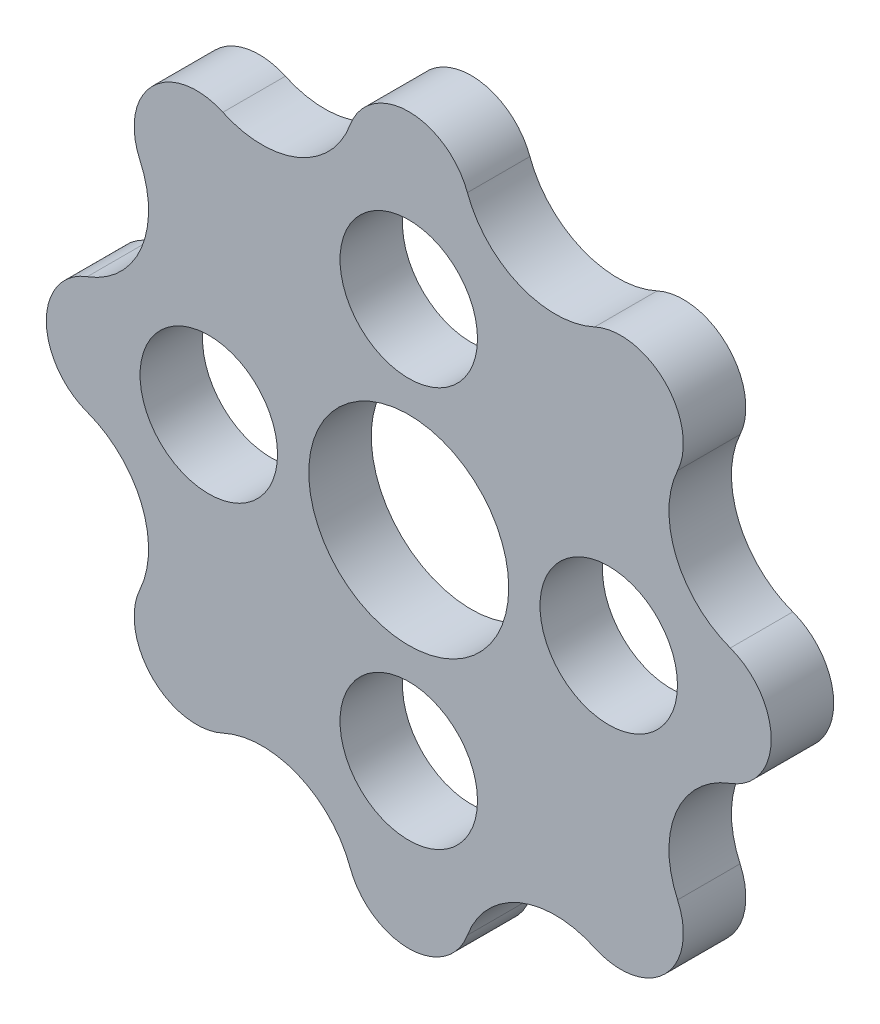
ISO-10303-21;
HEADER;
FILE_DESCRIPTION(('STEP AP214'),'2;1');
FILE_NAME('part.step','',(''),(''),'','','');
FILE_SCHEMA(('AUTOMOTIVE_DESIGN { 1 0 10303 214 1 1 1 1 }'));
ENDSEC;
DATA;
#1=APPLICATION_CONTEXT('core data for automotive mechanical design processes');
#2=APPLICATION_PROTOCOL_DEFINITION('international standard','automotive_design',2000,#1);
#3=PRODUCT_CONTEXT('',#1,'mechanical');
#4=PRODUCT('Part','Part','',(#3));
#5=PRODUCT_RELATED_PRODUCT_CATEGORY('part','',(#4));
#6=PRODUCT_DEFINITION_FORMATION('','',#4);
#7=PRODUCT_DEFINITION_CONTEXT('part definition',#1,'design');
#8=PRODUCT_DEFINITION('design','',#6,#7);
#9=PRODUCT_DEFINITION_SHAPE('','',#8);
#10=(LENGTH_UNIT() NAMED_UNIT(*) SI_UNIT(.MILLI.,.METRE.));
#11=(NAMED_UNIT(*) PLANE_ANGLE_UNIT() SI_UNIT($,.RADIAN.));
#12=(NAMED_UNIT(*) SI_UNIT($,.STERADIAN.) SOLID_ANGLE_UNIT());
#13=UNCERTAINTY_MEASURE_WITH_UNIT(LENGTH_MEASURE(1.E-05),#10,'distance_accuracy_value','');
#14=(GEOMETRIC_REPRESENTATION_CONTEXT(3) GLOBAL_UNCERTAINTY_ASSIGNED_CONTEXT((#13)) GLOBAL_UNIT_ASSIGNED_CONTEXT((#10,
#11,#12)) REPRESENTATION_CONTEXT('',''));
#15=CARTESIAN_POINT('',(0.,0.,0.));
#16=DIRECTION('',(0.,0.,1.));
#17=DIRECTION('',(1.,0.,0.));
#18=AXIS2_PLACEMENT_3D('',#15,#16,#17);
#19=CARTESIAN_POINT('',(-23.4602578727574,56.638072733181,10.));
#20=DIRECTION('',(0.,0.,-1.));
#21=DIRECTION('',(-1.,0.,0.));
#22=AXIS2_PLACEMENT_3D('',#19,#20,#21);
#23=CYLINDRICAL_SURFACE('',#22,15.);
#24=CARTESIAN_POINT('',(-23.4602578727574,56.638072733181,0.));
#25=DIRECTION('',(0.,0.,-1.));
#26=DIRECTION('',(1.,0.,0.));
#27=AXIS2_PLACEMENT_3D('',#24,#25,#26);
#28=CIRCLE('',#27,15.);
#29=CARTESIAN_POINT('',(-9.38410314910299,51.4552290932724,0.));
#30=VERTEX_POINT('',#29);
#31=CARTESIAN_POINT('',(-29.7487784472756,43.0199043914447,0.));
#32=VERTEX_POINT('',#31);
#33=EDGE_CURVE('E185',#30,#32,#28,.T.);
#34=ORIENTED_EDGE('',*,*,#33,.T.);
#35=DIRECTION('',(0.,0.,-1.));
#36=VECTOR('',#35,1.);
#37=CARTESIAN_POINT('',(-29.7487784472756,43.0199043914447,10.));
#38=LINE('',#37,#36);
#39=CARTESIAN_POINT('',(-29.7487784472756,43.0199043914447,10.));
#40=VERTEX_POINT('',#39);
#41=EDGE_CURVE('E11',#40,#32,#38,.T.);
#42=ORIENTED_EDGE('',*,*,#41,.F.);
#43=CARTESIAN_POINT('',(-23.4602578727574,56.638072733181,10.));
#44=DIRECTION('',(0.,0.,-1.));
#45=DIRECTION('',(1.,0.,0.));
#46=AXIS2_PLACEMENT_3D('',#43,#44,#45);
#47=CIRCLE('',#46,15.);
#48=CARTESIAN_POINT('',(-9.38410314910299,51.4552290932724,10.));
#49=VERTEX_POINT('',#48);
#50=EDGE_CURVE('E216',#49,#40,#47,.T.);
#51=ORIENTED_EDGE('',*,*,#50,.F.);
#52=DIRECTION('',(0.,0.,-1.));
#53=VECTOR('',#52,1.);
#54=CARTESIAN_POINT('',(-9.38410314910299,51.4552290932724,10.));
#55=LINE('',#54,#53);
#56=EDGE_CURVE('E181',#49,#30,#55,.T.);
#57=ORIENTED_EDGE('',*,*,#56,.T.);
#58=EDGE_LOOP('',(#34,#42,#51,#57));
#59=FACE_BOUND('',#58,.T.);
#60=ADVANCED_FACE('F41',(#59),#23,.F.);
#61=CARTESIAN_POINT('',(-33.9411254969543,33.9411254969543,10.));
#62=DIRECTION('',(0.,0.,-1.));
#63=DIRECTION('',(-1.,0.,0.));
#64=AXIS2_PLACEMENT_3D('',#61,#62,#63);
#65=CYLINDRICAL_SURFACE('',#64,9.99999999999973);
#66=CARTESIAN_POINT('',(-33.9411254969543,33.9411254969543,0.));
#67=DIRECTION('',(0.,0.,1.));
#68=DIRECTION('',(1.,0.,0.));
#69=AXIS2_PLACEMENT_3D('',#66,#67,#68);
#70=CIRCLE('',#69,9.99999999999973);
#71=CARTESIAN_POINT('',(-43.0199043914446,29.748778447276,0.));
#72=VERTEX_POINT('',#71);
#73=EDGE_CURVE('E188',#32,#72,#70,.T.);
#74=ORIENTED_EDGE('',*,*,#73,.T.);
#75=DIRECTION('',(0.,0.,-1.));
#76=VECTOR('',#75,1.);
#77=CARTESIAN_POINT('',(-43.0199043914446,29.748778447276,10.));
#78=LINE('',#77,#76);
#79=CARTESIAN_POINT('',(-43.0199043914446,29.748778447276,10.));
#80=VERTEX_POINT('',#79);
#81=EDGE_CURVE('E49',#80,#72,#78,.T.);
#82=ORIENTED_EDGE('',*,*,#81,.F.);
#83=CARTESIAN_POINT('',(-33.9411254969543,33.9411254969543,10.));
#84=DIRECTION('',(0.,0.,1.));
#85=DIRECTION('',(1.,0.,0.));
#86=AXIS2_PLACEMENT_3D('',#83,#84,#85);
#87=CIRCLE('',#86,9.99999999999973);
#88=EDGE_CURVE('E124',#40,#80,#87,.T.);
#89=ORIENTED_EDGE('',*,*,#88,.F.);
#90=ORIENTED_EDGE('',*,*,#41,.T.);
#91=EDGE_LOOP('',(#74,#82,#89,#90));
#92=FACE_BOUND('',#91,.T.);
#93=ADVANCED_FACE('F315',(#92),#65,.T.);
#94=CARTESIAN_POINT('',(-56.6380727331807,23.4602578727581,10.));
#95=DIRECTION('',(0.,0.,-1.));
#96=DIRECTION('',(-1.,0.,0.));
#97=AXIS2_PLACEMENT_3D('',#94,#95,#96);
#98=CYLINDRICAL_SURFACE('',#97,15.);
#99=CARTESIAN_POINT('',(-56.6380727331807,23.4602578727581,0.));
#100=DIRECTION('',(0.,0.,-1.));
#101=DIRECTION('',(1.,0.,0.));
#102=AXIS2_PLACEMENT_3D('',#99,#100,#101);
#103=CIRCLE('',#102,15.);
#104=CARTESIAN_POINT('',(-51.4552290932721,9.38410314910309,0.));
#105=VERTEX_POINT('',#104);
#106=EDGE_CURVE('E191',#72,#105,#103,.T.);
#107=ORIENTED_EDGE('',*,*,#106,.T.);
#108=DIRECTION('',(0.,0.,-1.));
#109=VECTOR('',#108,1.);
#110=CARTESIAN_POINT('',(-51.4552290932721,9.38410314910309,10.));
#111=LINE('',#110,#109);
#112=CARTESIAN_POINT('',(-51.4552290932721,9.38410314910309,10.));
#113=VERTEX_POINT('',#112);
#114=EDGE_CURVE('E247',#113,#105,#111,.T.);
#115=ORIENTED_EDGE('',*,*,#114,.F.);
#116=CARTESIAN_POINT('',(-56.6380727331807,23.4602578727581,10.));
#117=DIRECTION('',(0.,0.,-1.));
#118=DIRECTION('',(1.,0.,0.));
#119=AXIS2_PLACEMENT_3D('',#116,#117,#118);
#120=CIRCLE('',#119,15.);
#121=EDGE_CURVE('E255',#80,#113,#120,.T.);
#122=ORIENTED_EDGE('',*,*,#121,.F.);
#123=ORIENTED_EDGE('',*,*,#81,.T.);
#124=EDGE_LOOP('',(#107,#115,#122,#123));
#125=FACE_BOUND('',#124,.T.);
#126=ADVANCED_FACE('F253',(#125),#98,.F.);
#127=CARTESIAN_POINT('',(-48.,0.,10.));
#128=DIRECTION('',(0.,0.,-1.));
#129=DIRECTION('',(-1.,0.,0.));
#130=AXIS2_PLACEMENT_3D('',#127,#128,#129);
#131=CYLINDRICAL_SURFACE('',#130,10.);
#132=CARTESIAN_POINT('',(-48.,0.,0.));
#133=DIRECTION('',(0.,0.,1.));
#134=DIRECTION('',(1.,0.,0.));
#135=AXIS2_PLACEMENT_3D('',#132,#133,#134);
#136=CIRCLE('',#135,10.);
#137=CARTESIAN_POINT('',(-51.4552290932725,-9.38410314910241,0.));
#138=VERTEX_POINT('',#137);
#139=EDGE_CURVE('E193',#105,#138,#136,.T.);
#140=ORIENTED_EDGE('',*,*,#139,.T.);
#141=DIRECTION('',(0.,0.,-1.));
#142=VECTOR('',#141,1.);
#143=CARTESIAN_POINT('',(-51.4552290932725,-9.38410314910241,10.));
#144=LINE('',#143,#142);
#145=CARTESIAN_POINT('',(-51.4552290932725,-9.38410314910241,10.));
#146=VERTEX_POINT('',#145);
#147=EDGE_CURVE('E244',#146,#138,#144,.T.);
#148=ORIENTED_EDGE('',*,*,#147,.F.);
#149=CARTESIAN_POINT('',(-48.,0.,10.));
#150=DIRECTION('',(0.,0.,1.));
#151=DIRECTION('',(1.,0.,0.));
#152=AXIS2_PLACEMENT_3D('',#149,#150,#151);
#153=CIRCLE('',#152,10.);
#154=EDGE_CURVE('E273',#113,#146,#153,.T.);
#155=ORIENTED_EDGE('',*,*,#154,.F.);
#156=ORIENTED_EDGE('',*,*,#114,.T.);
#157=EDGE_LOOP('',(#140,#148,#155,#156));
#158=FACE_BOUND('',#157,.T.);
#159=ADVANCED_FACE('F264',(#158),#131,.T.);
#160=CARTESIAN_POINT('',(-56.6380727331813,-23.4602578727568,10.));
#161=DIRECTION('',(0.,0.,-1.));
#162=DIRECTION('',(-1.,0.,0.));
#163=AXIS2_PLACEMENT_3D('',#160,#161,#162);
#164=CYLINDRICAL_SURFACE('',#163,15.);
#165=CARTESIAN_POINT('',(-56.6380727331813,-23.4602578727568,0.));
#166=DIRECTION('',(0.,0.,-1.));
#167=DIRECTION('',(1.,0.,0.));
#168=AXIS2_PLACEMENT_3D('',#165,#166,#167);
#169=CIRCLE('',#168,15.);
#170=CARTESIAN_POINT('',(-43.0199043914449,-29.7487784472753,0.));
#171=VERTEX_POINT('',#170);
#172=EDGE_CURVE('E195',#138,#171,#169,.T.);
#173=ORIENTED_EDGE('',*,*,#172,.T.);
#174=DIRECTION('',(0.,0.,-1.));
#175=VECTOR('',#174,1.);
#176=CARTESIAN_POINT('',(-43.0199043914449,-29.7487784472753,10.));
#177=LINE('',#176,#175);
#178=CARTESIAN_POINT('',(-43.0199043914449,-29.7487784472753,10.));
#179=VERTEX_POINT('',#178);
#180=EDGE_CURVE('E241',#179,#171,#177,.T.);
#181=ORIENTED_EDGE('',*,*,#180,.F.);
#182=CARTESIAN_POINT('',(-56.6380727331813,-23.4602578727568,10.));
#183=DIRECTION('',(0.,0.,-1.));
#184=DIRECTION('',(1.,0.,0.));
#185=AXIS2_PLACEMENT_3D('',#182,#183,#184);
#186=CIRCLE('',#185,15.);
#187=EDGE_CURVE('E270',#146,#179,#186,.T.);
#188=ORIENTED_EDGE('',*,*,#187,.F.);
#189=ORIENTED_EDGE('',*,*,#147,.T.);
#190=EDGE_LOOP('',(#173,#181,#188,#189));
#191=FACE_BOUND('',#190,.T.);
#192=ADVANCED_FACE('F268',(#191),#164,.F.);
#193=CARTESIAN_POINT('',(-33.9411254969543,-33.9411254969543,10.));
#194=DIRECTION('',(0.,0.,-1.));
#195=DIRECTION('',(-1.,0.,0.));
#196=AXIS2_PLACEMENT_3D('',#193,#194,#195);
#197=CYLINDRICAL_SURFACE('',#196,10.);
#198=CARTESIAN_POINT('',(-33.9411254969543,-33.9411254969543,0.));
#199=DIRECTION('',(0.,0.,1.));
#200=DIRECTION('',(1.,0.,0.));
#201=AXIS2_PLACEMENT_3D('',#198,#199,#200);
#202=CIRCLE('',#201,10.);
#203=CARTESIAN_POINT('',(-29.7487784472759,-43.0199043914447,0.));
#204=VERTEX_POINT('',#203);
#205=EDGE_CURVE('E197',#171,#204,#202,.T.);
#206=ORIENTED_EDGE('',*,*,#205,.T.);
#207=DIRECTION('',(0.,0.,-1.));
#208=VECTOR('',#207,1.);
#209=CARTESIAN_POINT('',(-29.7487784472759,-43.0199043914447,10.));
#210=LINE('',#209,#208);
#211=CARTESIAN_POINT('',(-29.7487784472759,-43.0199043914447,10.));
#212=VERTEX_POINT('',#211);
#213=EDGE_CURVE('E238',#212,#204,#210,.T.);
#214=ORIENTED_EDGE('',*,*,#213,.F.);
#215=CARTESIAN_POINT('',(-33.9411254969543,-33.9411254969543,10.));
#216=DIRECTION('',(0.,0.,1.));
#217=DIRECTION('',(1.,0.,0.));
#218=AXIS2_PLACEMENT_3D('',#215,#216,#217);
#219=CIRCLE('',#218,10.);
#220=EDGE_CURVE('E272',#179,#212,#219,.T.);
#221=ORIENTED_EDGE('',*,*,#220,.F.);
#222=ORIENTED_EDGE('',*,*,#180,.T.);
#223=EDGE_LOOP('',(#206,#214,#221,#222));
#224=FACE_BOUND('',#223,.T.);
#225=ADVANCED_FACE('F328',(#224),#197,.T.);
#226=CARTESIAN_POINT('',(-23.4602578727579,-56.6380727331808,10.));
#227=DIRECTION('',(0.,0.,-1.));
#228=DIRECTION('',(-1.,0.,0.));
#229=AXIS2_PLACEMENT_3D('',#226,#227,#228);
#230=CYLINDRICAL_SURFACE('',#229,15.);
#231=CARTESIAN_POINT('',(-23.4602578727579,-56.6380727331808,0.));
#232=DIRECTION('',(0.,0.,-1.));
#233=DIRECTION('',(1.,0.,0.));
#234=AXIS2_PLACEMENT_3D('',#231,#232,#233);
#235=CIRCLE('',#234,15.);
#236=CARTESIAN_POINT('',(-9.38410314910306,-51.4552290932722,0.));
#237=VERTEX_POINT('',#236);
#238=EDGE_CURVE('E199',#204,#237,#235,.T.);
#239=ORIENTED_EDGE('',*,*,#238,.T.);
#240=DIRECTION('',(0.,0.,-1.));
#241=VECTOR('',#240,1.);
#242=CARTESIAN_POINT('',(-9.38410314910306,-51.4552290932722,10.));
#243=LINE('',#242,#241);
#244=CARTESIAN_POINT('',(-9.38410314910306,-51.4552290932722,10.));
#245=VERTEX_POINT('',#244);
#246=EDGE_CURVE('E235',#245,#237,#243,.T.);
#247=ORIENTED_EDGE('',*,*,#246,.F.);
#248=CARTESIAN_POINT('',(-23.4602578727579,-56.6380727331808,10.));
#249=DIRECTION('',(0.,0.,-1.));
#250=DIRECTION('',(1.,0.,0.));
#251=AXIS2_PLACEMENT_3D('',#248,#249,#250);
#252=CIRCLE('',#251,15.);
#253=EDGE_CURVE('E275',#212,#245,#252,.T.);
#254=ORIENTED_EDGE('',*,*,#253,.F.);
#255=ORIENTED_EDGE('',*,*,#213,.T.);
#256=EDGE_LOOP('',(#239,#247,#254,#255));
#257=FACE_BOUND('',#256,.T.);
#258=ADVANCED_FACE('F331',(#257),#230,.F.);
#259=CARTESIAN_POINT('',(0.,-48.,10.));
#260=DIRECTION('',(0.,0.,-1.));
#261=DIRECTION('',(-1.,0.,0.));
#262=AXIS2_PLACEMENT_3D('',#259,#260,#261);
#263=CYLINDRICAL_SURFACE('',#262,10.);
#264=CARTESIAN_POINT('',(0.,-48.,0.));
#265=DIRECTION('',(0.,0.,1.));
#266=DIRECTION('',(1.,0.,0.));
#267=AXIS2_PLACEMENT_3D('',#264,#265,#266);
#268=CIRCLE('',#267,10.);
#269=CARTESIAN_POINT('',(9.3841031491026,-51.4552290932725,0.));
#270=VERTEX_POINT('',#269);
#271=EDGE_CURVE('E201',#237,#270,#268,.T.);
#272=ORIENTED_EDGE('',*,*,#271,.T.);
#273=DIRECTION('',(0.,0.,-1.));
#274=VECTOR('',#273,1.);
#275=CARTESIAN_POINT('',(9.3841031491026,-51.4552290932725,10.));
#276=LINE('',#275,#274);
#277=CARTESIAN_POINT('',(9.3841031491026,-51.4552290932725,10.));
#278=VERTEX_POINT('',#277);
#279=EDGE_CURVE('E232',#278,#270,#276,.T.);
#280=ORIENTED_EDGE('',*,*,#279,.F.);
#281=CARTESIAN_POINT('',(0.,-48.,10.));
#282=DIRECTION('',(0.,0.,1.));
#283=DIRECTION('',(1.,0.,0.));
#284=AXIS2_PLACEMENT_3D('',#281,#282,#283);
#285=CIRCLE('',#284,10.);
#286=EDGE_CURVE('E281',#245,#278,#285,.T.);
#287=ORIENTED_EDGE('',*,*,#286,.F.);
#288=ORIENTED_EDGE('',*,*,#246,.T.);
#289=EDGE_LOOP('',(#272,#280,#287,#288));
#290=FACE_BOUND('',#289,.T.);
#291=ADVANCED_FACE('F335',(#290),#263,.T.);
#292=CARTESIAN_POINT('',(23.460257872757,-56.6380727331812,10.));
#293=DIRECTION('',(0.,0.,-1.));
#294=DIRECTION('',(-1.,0.,0.));
#295=AXIS2_PLACEMENT_3D('',#292,#293,#294);
#296=CYLINDRICAL_SURFACE('',#295,15.);
#297=CARTESIAN_POINT('',(23.460257872757,-56.6380727331812,0.));
#298=DIRECTION('',(0.,0.,-1.));
#299=DIRECTION('',(1.,0.,0.));
#300=AXIS2_PLACEMENT_3D('',#297,#298,#299);
#301=CIRCLE('',#300,15.);
#302=CARTESIAN_POINT('',(29.7487784472753,-43.019904391445,0.));
#303=VERTEX_POINT('',#302);
#304=EDGE_CURVE('E203',#270,#303,#301,.T.);
#305=ORIENTED_EDGE('',*,*,#304,.T.);
#306=DIRECTION('',(0.,0.,-1.));
#307=VECTOR('',#306,1.);
#308=CARTESIAN_POINT('',(29.7487784472753,-43.019904391445,10.));
#309=LINE('',#308,#307);
#310=CARTESIAN_POINT('',(29.7487784472753,-43.019904391445,10.));
#311=VERTEX_POINT('',#310);
#312=EDGE_CURVE('E229',#311,#303,#309,.T.);
#313=ORIENTED_EDGE('',*,*,#312,.F.);
#314=CARTESIAN_POINT('',(23.460257872757,-56.6380727331812,10.));
#315=DIRECTION('',(0.,0.,-1.));
#316=DIRECTION('',(1.,0.,0.));
#317=AXIS2_PLACEMENT_3D('',#314,#315,#316);
#318=CIRCLE('',#317,15.);
#319=EDGE_CURVE('E283',#278,#311,#318,.T.);
#320=ORIENTED_EDGE('',*,*,#319,.F.);
#321=ORIENTED_EDGE('',*,*,#279,.T.);
#322=EDGE_LOOP('',(#305,#313,#320,#321));
#323=FACE_BOUND('',#322,.T.);
#324=ADVANCED_FACE('F339',(#323),#296,.F.);
#325=CARTESIAN_POINT('',(33.9411254969543,-33.9411254969543,10.));
#326=DIRECTION('',(0.,0.,-1.));
#327=DIRECTION('',(-1.,0.,0.));
#328=AXIS2_PLACEMENT_3D('',#325,#326,#327);
#329=CYLINDRICAL_SURFACE('',#328,10.);
#330=CARTESIAN_POINT('',(33.9411254969543,-33.9411254969543,0.));
#331=DIRECTION('',(0.,0.,1.));
#332=DIRECTION('',(1.,0.,0.));
#333=AXIS2_PLACEMENT_3D('',#330,#331,#332);
#334=CIRCLE('',#333,10.);
#335=CARTESIAN_POINT('',(43.0199043914448,-29.7487784472757,0.));
#336=VERTEX_POINT('',#335);
#337=EDGE_CURVE('E205',#303,#336,#334,.T.);
#338=ORIENTED_EDGE('',*,*,#337,.T.);
#339=DIRECTION('',(0.,0.,-1.));
#340=VECTOR('',#339,1.);
#341=CARTESIAN_POINT('',(43.0199043914448,-29.7487784472757,10.));
#342=LINE('',#341,#340);
#343=CARTESIAN_POINT('',(43.0199043914448,-29.7487784472757,10.));
#344=VERTEX_POINT('',#343);
#345=EDGE_CURVE('E226',#344,#336,#342,.T.);
#346=ORIENTED_EDGE('',*,*,#345,.F.);
#347=CARTESIAN_POINT('',(33.9411254969543,-33.9411254969543,10.));
#348=DIRECTION('',(0.,0.,1.));
#349=DIRECTION('',(1.,0.,0.));
#350=AXIS2_PLACEMENT_3D('',#347,#348,#349);
#351=CIRCLE('',#350,10.);
#352=EDGE_CURVE('E285',#311,#344,#351,.T.);
#353=ORIENTED_EDGE('',*,*,#352,.F.);
#354=ORIENTED_EDGE('',*,*,#312,.T.);
#355=EDGE_LOOP('',(#338,#346,#353,#354));
#356=FACE_BOUND('',#355,.T.);
#357=ADVANCED_FACE('F343',(#356),#329,.T.);
#358=CARTESIAN_POINT('',(56.6380727331809,-23.4602578727577,10.));
#359=DIRECTION('',(0.,0.,-1.));
#360=DIRECTION('',(-1.,0.,0.));
#361=AXIS2_PLACEMENT_3D('',#358,#359,#360);
#362=CYLINDRICAL_SURFACE('',#361,15.);
#363=CARTESIAN_POINT('',(56.6380727331809,-23.4602578727577,0.));
#364=DIRECTION('',(0.,0.,-1.));
#365=DIRECTION('',(1.,0.,0.));
#366=AXIS2_PLACEMENT_3D('',#363,#364,#365);
#367=CIRCLE('',#366,15.);
#368=CARTESIAN_POINT('',(51.4552290932723,-9.38410314910304,0.));
#369=VERTEX_POINT('',#368);
#370=EDGE_CURVE('E207',#336,#369,#367,.T.);
#371=ORIENTED_EDGE('',*,*,#370,.T.);
#372=DIRECTION('',(0.,0.,-1.));
#373=VECTOR('',#372,1.);
#374=CARTESIAN_POINT('',(51.4552290932723,-9.38410314910304,10.));
#375=LINE('',#374,#373);
#376=CARTESIAN_POINT('',(51.4552290932723,-9.38410314910304,10.));
#377=VERTEX_POINT('',#376);
#378=EDGE_CURVE('E223',#377,#369,#375,.T.);
#379=ORIENTED_EDGE('',*,*,#378,.F.);
#380=CARTESIAN_POINT('',(56.6380727331809,-23.4602578727577,10.));
#381=DIRECTION('',(0.,0.,-1.));
#382=DIRECTION('',(1.,0.,0.));
#383=AXIS2_PLACEMENT_3D('',#380,#381,#382);
#384=CIRCLE('',#383,15.);
#385=EDGE_CURVE('E287',#344,#377,#384,.T.);
#386=ORIENTED_EDGE('',*,*,#385,.F.);
#387=ORIENTED_EDGE('',*,*,#345,.T.);
#388=EDGE_LOOP('',(#371,#379,#386,#387));
#389=FACE_BOUND('',#388,.T.);
#390=ADVANCED_FACE('F347',(#389),#362,.F.);
#391=CARTESIAN_POINT('',(48.,0.,10.));
#392=DIRECTION('',(0.,0.,-1.));
#393=DIRECTION('',(-1.,0.,0.));
#394=AXIS2_PLACEMENT_3D('',#391,#392,#393);
#395=CYLINDRICAL_SURFACE('',#394,10.);
#396=CARTESIAN_POINT('',(48.,0.,0.));
#397=DIRECTION('',(0.,0.,1.));
#398=DIRECTION('',(1.,0.,0.));
#399=AXIS2_PLACEMENT_3D('',#396,#397,#398);
#400=CIRCLE('',#399,10.);
#401=CARTESIAN_POINT('',(51.4552290932725,9.38410314910277,0.));
#402=VERTEX_POINT('',#401);
#403=EDGE_CURVE('E209',#369,#402,#400,.T.);
#404=ORIENTED_EDGE('',*,*,#403,.T.);
#405=DIRECTION('',(0.,0.,-1.));
#406=VECTOR('',#405,1.);
#407=CARTESIAN_POINT('',(51.4552290932725,9.38410314910277,10.));
#408=LINE('',#407,#406);
#409=CARTESIAN_POINT('',(51.4552290932725,9.38410314910277,10.));
#410=VERTEX_POINT('',#409);
#411=EDGE_CURVE('E220',#410,#402,#408,.T.);
#412=ORIENTED_EDGE('',*,*,#411,.F.);
#413=CARTESIAN_POINT('',(48.,0.,10.));
#414=DIRECTION('',(0.,0.,1.));
#415=DIRECTION('',(1.,0.,0.));
#416=AXIS2_PLACEMENT_3D('',#413,#414,#415);
#417=CIRCLE('',#416,10.);
#418=EDGE_CURVE('E289',#377,#410,#417,.T.);
#419=ORIENTED_EDGE('',*,*,#418,.F.);
#420=ORIENTED_EDGE('',*,*,#378,.T.);
#421=EDGE_LOOP('',(#404,#412,#419,#420));
#422=FACE_BOUND('',#421,.T.);
#423=ADVANCED_FACE('F295',(#422),#395,.T.);
#424=CARTESIAN_POINT('',(56.6380727331811,23.4602578727572,10.));
#425=DIRECTION('',(0.,0.,-1.));
#426=DIRECTION('',(-1.,0.,0.));
#427=AXIS2_PLACEMENT_3D('',#424,#425,#426);
#428=CYLINDRICAL_SURFACE('',#427,15.);
#429=CARTESIAN_POINT('',(56.6380727331811,23.4602578727572,0.));
#430=DIRECTION('',(0.,0.,-1.));
#431=DIRECTION('',(1.,0.,0.));
#432=AXIS2_PLACEMENT_3D('',#429,#430,#431);
#433=CIRCLE('',#432,15.);
#434=CARTESIAN_POINT('',(43.019904391445,29.7487784472754,0.));
#435=VERTEX_POINT('',#434);
#436=EDGE_CURVE('E211',#402,#435,#433,.T.);
#437=ORIENTED_EDGE('',*,*,#436,.T.);
#438=DIRECTION('',(0.,0.,-1.));
#439=VECTOR('',#438,1.);
#440=CARTESIAN_POINT('',(43.019904391445,29.7487784472754,10.));
#441=LINE('',#440,#439);
#442=CARTESIAN_POINT('',(43.019904391445,29.7487784472754,10.));
#443=VERTEX_POINT('',#442);
#444=EDGE_CURVE('E176',#443,#435,#441,.T.);
#445=ORIENTED_EDGE('',*,*,#444,.F.);
#446=CARTESIAN_POINT('',(56.6380727331811,23.4602578727572,10.));
#447=DIRECTION('',(0.,0.,-1.));
#448=DIRECTION('',(1.,0.,0.));
#449=AXIS2_PLACEMENT_3D('',#446,#447,#448);
#450=CIRCLE('',#449,15.);
#451=EDGE_CURVE('E167',#410,#443,#450,.T.);
#452=ORIENTED_EDGE('',*,*,#451,.F.);
#453=ORIENTED_EDGE('',*,*,#411,.T.);
#454=EDGE_LOOP('',(#437,#445,#452,#453));
#455=FACE_BOUND('',#454,.T.);
#456=ADVANCED_FACE('F299',(#455),#428,.F.);
#457=CARTESIAN_POINT('',(33.9411254969543,33.9411254969543,10.));
#458=DIRECTION('',(0.,0.,-1.));
#459=DIRECTION('',(-1.,0.,0.));
#460=AXIS2_PLACEMENT_3D('',#457,#458,#459);
#461=CYLINDRICAL_SURFACE('',#460,10.);
#462=CARTESIAN_POINT('',(33.9411254969543,33.9411254969543,0.));
#463=DIRECTION('',(0.,0.,1.));
#464=DIRECTION('',(1.,0.,0.));
#465=AXIS2_PLACEMENT_3D('',#462,#463,#464);
#466=CIRCLE('',#465,10.);
#467=CARTESIAN_POINT('',(29.7487784472756,43.0199043914449,0.));
#468=VERTEX_POINT('',#467);
#469=EDGE_CURVE('E175',#435,#468,#466,.T.);
#470=ORIENTED_EDGE('',*,*,#469,.T.);
#471=DIRECTION('',(0.,0.,-1.));
#472=VECTOR('',#471,1.);
#473=CARTESIAN_POINT('',(29.7487784472756,43.0199043914449,10.));
#474=LINE('',#473,#472);
#475=CARTESIAN_POINT('',(29.7487784472756,43.0199043914449,10.));
#476=VERTEX_POINT('',#475);
#477=EDGE_CURVE('E172',#476,#468,#474,.T.);
#478=ORIENTED_EDGE('',*,*,#477,.F.);
#479=CARTESIAN_POINT('',(33.9411254969543,33.9411254969543,10.));
#480=DIRECTION('',(0.,0.,1.));
#481=DIRECTION('',(1.,0.,0.));
#482=AXIS2_PLACEMENT_3D('',#479,#480,#481);
#483=CIRCLE('',#482,10.);
#484=EDGE_CURVE('E161',#443,#476,#483,.T.);
#485=ORIENTED_EDGE('',*,*,#484,.F.);
#486=ORIENTED_EDGE('',*,*,#444,.T.);
#487=EDGE_LOOP('',(#470,#478,#485,#486));
#488=FACE_BOUND('',#487,.T.);
#489=ADVANCED_FACE('F173',(#488),#461,.T.);
#490=CARTESIAN_POINT('',(23.4602578727575,56.638072733181,10.));
#491=DIRECTION('',(0.,0.,-1.));
#492=DIRECTION('',(-1.,0.,0.));
#493=AXIS2_PLACEMENT_3D('',#490,#491,#492);
#494=CYLINDRICAL_SURFACE('',#493,15.);
#495=CARTESIAN_POINT('',(23.4602578727575,56.638072733181,0.));
#496=DIRECTION('',(0.,0.,-1.));
#497=DIRECTION('',(1.,0.,0.));
#498=AXIS2_PLACEMENT_3D('',#495,#496,#497);
#499=CIRCLE('',#498,15.);
#500=CARTESIAN_POINT('',(9.38410314910301,51.4552290932724,0.));
#501=VERTEX_POINT('',#500);
#502=EDGE_CURVE('E110',#468,#501,#499,.T.);
#503=ORIENTED_EDGE('',*,*,#502,.T.);
#504=DIRECTION('',(0.,0.,-1.));
#505=VECTOR('',#504,1.);
#506=CARTESIAN_POINT('',(9.38410314910301,51.4552290932724,10.));
#507=LINE('',#506,#505);
#508=CARTESIAN_POINT('',(9.38410314910301,51.4552290932724,10.));
#509=VERTEX_POINT('',#508);
#510=EDGE_CURVE('E177',#509,#501,#507,.T.);
#511=ORIENTED_EDGE('',*,*,#510,.F.);
#512=CARTESIAN_POINT('',(23.4602578727575,56.638072733181,10.));
#513=DIRECTION('',(0.,0.,-1.));
#514=DIRECTION('',(1.,0.,0.));
#515=AXIS2_PLACEMENT_3D('',#512,#513,#514);
#516=CIRCLE('',#515,15.);
#517=EDGE_CURVE('E165',#476,#509,#516,.T.);
#518=ORIENTED_EDGE('',*,*,#517,.F.);
#519=ORIENTED_EDGE('',*,*,#477,.T.);
#520=EDGE_LOOP('',(#503,#511,#518,#519));
#521=FACE_BOUND('',#520,.T.);
#522=ADVANCED_FACE('F179',(#521),#494,.F.);
#523=CARTESIAN_POINT('',(0.,48.,10.));
#524=DIRECTION('',(0.,0.,-1.));
#525=DIRECTION('',(-1.,0.,0.));
#526=AXIS2_PLACEMENT_3D('',#523,#524,#525);
#527=CYLINDRICAL_SURFACE('',#526,10.);
#528=CARTESIAN_POINT('',(0.,48.,0.));
#529=DIRECTION('',(0.,0.,1.));
#530=DIRECTION('',(1.,0.,0.));
#531=AXIS2_PLACEMENT_3D('',#528,#529,#530);
#532=CIRCLE('',#531,10.);
#533=EDGE_CURVE('E116',#501,#30,#532,.T.);
#534=ORIENTED_EDGE('',*,*,#533,.T.);
#535=ORIENTED_EDGE('',*,*,#56,.F.);
#536=CARTESIAN_POINT('',(0.,48.,10.));
#537=DIRECTION('',(0.,0.,1.));
#538=DIRECTION('',(1.,0.,0.));
#539=AXIS2_PLACEMENT_3D('',#536,#537,#538);
#540=CIRCLE('',#539,10.);
#541=EDGE_CURVE('E57',#509,#49,#540,.T.);
#542=ORIENTED_EDGE('',*,*,#541,.F.);
#543=ORIENTED_EDGE('',*,*,#510,.T.);
#544=EDGE_LOOP('',(#534,#535,#542,#543));
#545=FACE_BOUND('',#544,.T.);
#546=ADVANCED_FACE('F303',(#545),#527,.T.);
#547=CARTESIAN_POINT('',(-11.7301289363787,52.3190363665905,10.));
#548=DIRECTION('',(0.,0.,1.));
#549=DIRECTION('',(1.,0.,0.));
#550=AXIS2_PLACEMENT_3D('',#547,#548,#549);
#551=PLANE('',#550);
#552=CARTESIAN_POINT('',(0.,32.,10.));
#553=DIRECTION('',(0.,0.,1.));
#554=DIRECTION('',(1.,0.,0.));
#555=AXIS2_PLACEMENT_3D('',#552,#553,#554);
#556=CIRCLE('',#555,11.);
#557=CARTESIAN_POINT('',(11.,32.,10.));
#558=VERTEX_POINT('',#557);
#559=EDGE_CURVE('E444',#558,#558,#556,.T.);
#560=ORIENTED_EDGE('',*,*,#559,.F.);
#561=EDGE_LOOP('',(#560));
#562=FACE_BOUND('',#561,.T.);
#563=CARTESIAN_POINT('',(32.,-1.1172740284298E-13,10.));
#564=DIRECTION('',(0.,0.,1.));
#565=DIRECTION('',(1.,0.,0.));
#566=AXIS2_PLACEMENT_3D('',#563,#564,#565);
#567=CIRCLE('',#566,11.);
#568=CARTESIAN_POINT('',(43.,-1.1172740284298E-13,10.));
#569=VERTEX_POINT('',#568);
#570=EDGE_CURVE('E449',#569,#569,#567,.T.);
#571=ORIENTED_EDGE('',*,*,#570,.F.);
#572=EDGE_LOOP('',(#571));
#573=FACE_BOUND('',#572,.T.);
#574=CARTESIAN_POINT('',(-2.23454805685961E-13,-32.,10.));
#575=DIRECTION('',(0.,0.,1.));
#576=DIRECTION('',(1.,0.,0.));
#577=AXIS2_PLACEMENT_3D('',#574,#575,#576);
#578=CIRCLE('',#577,11.);
#579=CARTESIAN_POINT('',(10.9999999999998,-32.,10.));
#580=VERTEX_POINT('',#579);
#581=EDGE_CURVE('E460',#580,#580,#578,.T.);
#582=ORIENTED_EDGE('',*,*,#581,.F.);
#583=EDGE_LOOP('',(#582));
#584=FACE_BOUND('',#583,.T.);
#585=CARTESIAN_POINT('',(-32.,3.35182208528941E-13,10.));
#586=DIRECTION('',(0.,0.,1.));
#587=DIRECTION('',(1.,0.,0.));
#588=AXIS2_PLACEMENT_3D('',#585,#586,#587);
#589=CIRCLE('',#588,11.);
#590=CARTESIAN_POINT('',(-21.,3.35182208528941E-13,10.));
#591=VERTEX_POINT('',#590);
#592=EDGE_CURVE('E477',#591,#591,#589,.T.);
#593=ORIENTED_EDGE('',*,*,#592,.F.);
#594=EDGE_LOOP('',(#593));
#595=FACE_BOUND('',#594,.T.);
#596=CARTESIAN_POINT('',(0.,0.,10.));
#597=DIRECTION('',(0.,0.,1.));
#598=DIRECTION('',(1.,0.,0.));
#599=AXIS2_PLACEMENT_3D('',#596,#597,#598);
#600=CIRCLE('',#599,16.);
#601=CARTESIAN_POINT('',(16.,0.,10.));
#602=VERTEX_POINT('',#601);
#603=EDGE_CURVE('E445',#602,#602,#600,.T.);
#604=ORIENTED_EDGE('',*,*,#603,.F.);
#605=EDGE_LOOP('',(#604));
#606=FACE_BOUND('',#605,.T.);
#607=ORIENTED_EDGE('',*,*,#50,.T.);
#608=ORIENTED_EDGE('',*,*,#88,.T.);
#609=ORIENTED_EDGE('',*,*,#121,.T.);
#610=ORIENTED_EDGE('',*,*,#154,.T.);
#611=ORIENTED_EDGE('',*,*,#187,.T.);
#612=ORIENTED_EDGE('',*,*,#220,.T.);
#613=ORIENTED_EDGE('',*,*,#253,.T.);
#614=ORIENTED_EDGE('',*,*,#286,.T.);
#615=ORIENTED_EDGE('',*,*,#319,.T.);
#616=ORIENTED_EDGE('',*,*,#352,.T.);
#617=ORIENTED_EDGE('',*,*,#385,.T.);
#618=ORIENTED_EDGE('',*,*,#418,.T.);
#619=ORIENTED_EDGE('',*,*,#451,.T.);
#620=ORIENTED_EDGE('',*,*,#484,.T.);
#621=ORIENTED_EDGE('',*,*,#517,.T.);
#622=ORIENTED_EDGE('',*,*,#541,.T.);
#623=EDGE_LOOP('',(#607,#608,#609,#610,#611,#612,#613,#614,#615,#616,#617,#618,#619,#620,#621,#622));
#624=FACE_BOUND('',#623,.T.);
#625=ADVANCED_FACE('F163',(#562,#573,#584,#595,#606,#624),#551,.T.);
#626=CARTESIAN_POINT('',(-11.7301289363787,52.3190363665905,0.));
#627=DIRECTION('',(0.,0.,1.));
#628=DIRECTION('',(1.,0.,0.));
#629=AXIS2_PLACEMENT_3D('',#626,#627,#628);
#630=PLANE('',#629);
#631=CARTESIAN_POINT('',(0.,32.,0.));
#632=DIRECTION('',(0.,0.,1.));
#633=DIRECTION('',(1.,0.,0.));
#634=AXIS2_PLACEMENT_3D('',#631,#632,#633);
#635=CIRCLE('',#634,11.);
#636=CARTESIAN_POINT('',(11.,32.,0.));
#637=VERTEX_POINT('',#636);
#638=EDGE_CURVE('E441',#637,#637,#635,.T.);
#639=ORIENTED_EDGE('',*,*,#638,.T.);
#640=EDGE_LOOP('',(#639));
#641=FACE_BOUND('',#640,.T.);
#642=CARTESIAN_POINT('',(32.,-1.1172740284298E-13,0.));
#643=DIRECTION('',(0.,0.,1.));
#644=DIRECTION('',(1.,0.,0.));
#645=AXIS2_PLACEMENT_3D('',#642,#643,#644);
#646=CIRCLE('',#645,11.);
#647=CARTESIAN_POINT('',(43.,-1.1172740284298E-13,0.));
#648=VERTEX_POINT('',#647);
#649=EDGE_CURVE('E457',#648,#648,#646,.T.);
#650=ORIENTED_EDGE('',*,*,#649,.T.);
#651=EDGE_LOOP('',(#650));
#652=FACE_BOUND('',#651,.T.);
#653=CARTESIAN_POINT('',(-2.23454805685961E-13,-32.,0.));
#654=DIRECTION('',(0.,0.,1.));
#655=DIRECTION('',(1.,0.,0.));
#656=AXIS2_PLACEMENT_3D('',#653,#654,#655);
#657=CIRCLE('',#656,11.);
#658=CARTESIAN_POINT('',(10.9999999999998,-32.,0.));
#659=VERTEX_POINT('',#658);
#660=EDGE_CURVE('E472',#659,#659,#657,.T.);
#661=ORIENTED_EDGE('',*,*,#660,.T.);
#662=EDGE_LOOP('',(#661));
#663=FACE_BOUND('',#662,.T.);
#664=CARTESIAN_POINT('',(-32.,3.35182208528941E-13,0.));
#665=DIRECTION('',(0.,0.,1.));
#666=DIRECTION('',(1.,0.,0.));
#667=AXIS2_PLACEMENT_3D('',#664,#665,#666);
#668=CIRCLE('',#667,11.);
#669=CARTESIAN_POINT('',(-21.,3.35182208528941E-13,0.));
#670=VERTEX_POINT('',#669);
#671=EDGE_CURVE('E452',#670,#670,#668,.T.);
#672=ORIENTED_EDGE('',*,*,#671,.T.);
#673=EDGE_LOOP('',(#672));
#674=FACE_BOUND('',#673,.T.);
#675=CARTESIAN_POINT('',(0.,0.,0.));
#676=DIRECTION('',(0.,0.,1.));
#677=DIRECTION('',(1.,0.,0.));
#678=AXIS2_PLACEMENT_3D('',#675,#676,#677);
#679=CIRCLE('',#678,16.);
#680=CARTESIAN_POINT('',(16.,0.,0.));
#681=VERTEX_POINT('',#680);
#682=EDGE_CURVE('E189',#681,#681,#679,.T.);
#683=ORIENTED_EDGE('',*,*,#682,.T.);
#684=EDGE_LOOP('',(#683));
#685=FACE_BOUND('',#684,.T.);
#686=ORIENTED_EDGE('',*,*,#33,.F.);
#687=ORIENTED_EDGE('',*,*,#533,.F.);
#688=ORIENTED_EDGE('',*,*,#502,.F.);
#689=ORIENTED_EDGE('',*,*,#469,.F.);
#690=ORIENTED_EDGE('',*,*,#436,.F.);
#691=ORIENTED_EDGE('',*,*,#403,.F.);
#692=ORIENTED_EDGE('',*,*,#370,.F.);
#693=ORIENTED_EDGE('',*,*,#337,.F.);
#694=ORIENTED_EDGE('',*,*,#304,.F.);
#695=ORIENTED_EDGE('',*,*,#271,.F.);
#696=ORIENTED_EDGE('',*,*,#238,.F.);
#697=ORIENTED_EDGE('',*,*,#205,.F.);
#698=ORIENTED_EDGE('',*,*,#172,.F.);
#699=ORIENTED_EDGE('',*,*,#139,.F.);
#700=ORIENTED_EDGE('',*,*,#106,.F.);
#701=ORIENTED_EDGE('',*,*,#73,.F.);
#702=EDGE_LOOP('',(#686,#687,#688,#689,#690,#691,#692,#693,#694,#695,#696,#697,#698,#699,#700,#701));
#703=FACE_BOUND('',#702,.T.);
#704=ADVANCED_FACE('F259',(#641,#652,#663,#674,#685,#703),#630,.F.);
#705=CARTESIAN_POINT('',(0.,0.,0.));
#706=DIRECTION('',(0.,0.,1.));
#707=DIRECTION('',(1.,0.,0.));
#708=AXIS2_PLACEMENT_3D('',#705,#706,#707);
#709=CYLINDRICAL_SURFACE('',#708,16.);
#710=ORIENTED_EDGE('',*,*,#682,.F.);
#711=EDGE_LOOP('',(#710));
#712=FACE_BOUND('',#711,.T.);
#713=ORIENTED_EDGE('',*,*,#603,.T.);
#714=EDGE_LOOP('',(#713));
#715=FACE_BOUND('',#714,.T.);
#716=ADVANCED_FACE('F386',(#712,#715),#709,.F.);
#717=CARTESIAN_POINT('',(-32.,3.35182208528941E-13,0.));
#718=DIRECTION('',(0.,0.,1.));
#719=DIRECTION('',(1.,0.,0.));
#720=AXIS2_PLACEMENT_3D('',#717,#718,#719);
#721=CYLINDRICAL_SURFACE('',#720,11.);
#722=ORIENTED_EDGE('',*,*,#671,.F.);
#723=EDGE_LOOP('',(#722));
#724=FACE_BOUND('',#723,.T.);
#725=ORIENTED_EDGE('',*,*,#592,.T.);
#726=EDGE_LOOP('',(#725));
#727=FACE_BOUND('',#726,.T.);
#728=ADVANCED_FACE('F395',(#724,#727),#721,.F.);
#729=CARTESIAN_POINT('',(-2.23454805685961E-13,-32.,0.));
#730=DIRECTION('',(0.,0.,1.));
#731=DIRECTION('',(1.,0.,0.));
#732=AXIS2_PLACEMENT_3D('',#729,#730,#731);
#733=CYLINDRICAL_SURFACE('',#732,11.);
#734=ORIENTED_EDGE('',*,*,#660,.F.);
#735=EDGE_LOOP('',(#734));
#736=FACE_BOUND('',#735,.T.);
#737=ORIENTED_EDGE('',*,*,#581,.T.);
#738=EDGE_LOOP('',(#737));
#739=FACE_BOUND('',#738,.T.);
#740=ADVANCED_FACE('F405',(#736,#739),#733,.F.);
#741=CARTESIAN_POINT('',(32.,-1.1172740284298E-13,0.));
#742=DIRECTION('',(0.,0.,1.));
#743=DIRECTION('',(1.,0.,0.));
#744=AXIS2_PLACEMENT_3D('',#741,#742,#743);
#745=CYLINDRICAL_SURFACE('',#744,11.);
#746=ORIENTED_EDGE('',*,*,#649,.F.);
#747=EDGE_LOOP('',(#746));
#748=FACE_BOUND('',#747,.T.);
#749=ORIENTED_EDGE('',*,*,#570,.T.);
#750=EDGE_LOOP('',(#749));
#751=FACE_BOUND('',#750,.T.);
#752=ADVANCED_FACE('F415',(#748,#751),#745,.F.);
#753=CARTESIAN_POINT('',(0.,32.,0.));
#754=DIRECTION('',(0.,0.,1.));
#755=DIRECTION('',(1.,0.,0.));
#756=AXIS2_PLACEMENT_3D('',#753,#754,#755);
#757=CYLINDRICAL_SURFACE('',#756,11.);
#758=ORIENTED_EDGE('',*,*,#638,.F.);
#759=EDGE_LOOP('',(#758));
#760=FACE_BOUND('',#759,.T.);
#761=ORIENTED_EDGE('',*,*,#559,.T.);
#762=EDGE_LOOP('',(#761));
#763=FACE_BOUND('',#762,.T.);
#764=ADVANCED_FACE('F425',(#760,#763),#757,.F.);
#765=CLOSED_SHELL('',(#60,#93,#126,#159,#192,#225,#258,#291,#324,#357,#390,#423,#456,#489,#522,
#546,#625,#704,#716,#728,#740,#752,#764));
#766=MANIFOLD_SOLID_BREP('B2',#765);
#767=ADVANCED_BREP_SHAPE_REPRESENTATION('',(#18,#766),#14);
#768=SHAPE_DEFINITION_REPRESENTATION(#9,#767);
ENDSEC;
END-ISO-10303-21;
